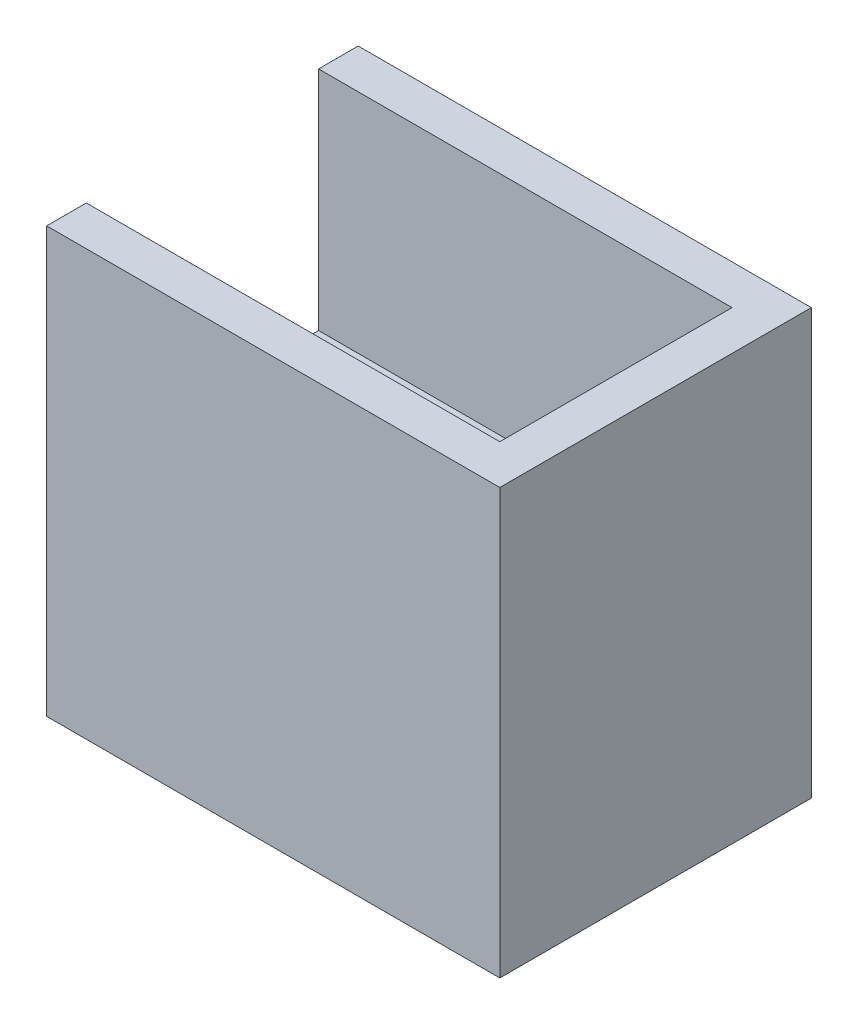
ISO-10303-21;
HEADER;
FILE_DESCRIPTION(('STEP AP214'),'2;1');
FILE_NAME('part.step','',(''),(''),'','','');
FILE_SCHEMA(('AUTOMOTIVE_DESIGN { 1 0 10303 214 1 1 1 1 }'));
ENDSEC;
DATA;
#1=APPLICATION_CONTEXT('core data for automotive mechanical design processes');
#2=APPLICATION_PROTOCOL_DEFINITION('international standard','automotive_design',2000,#1);
#3=PRODUCT_CONTEXT('',#1,'mechanical');
#4=PRODUCT('Part','Part','',(#3));
#5=PRODUCT_RELATED_PRODUCT_CATEGORY('part','',(#4));
#6=PRODUCT_DEFINITION_FORMATION('','',#4);
#7=PRODUCT_DEFINITION_CONTEXT('part definition',#1,'design');
#8=PRODUCT_DEFINITION('design','',#6,#7);
#9=PRODUCT_DEFINITION_SHAPE('','',#8);
#10=(LENGTH_UNIT() NAMED_UNIT(*) SI_UNIT(.MILLI.,.METRE.));
#11=(NAMED_UNIT(*) PLANE_ANGLE_UNIT() SI_UNIT($,.RADIAN.));
#12=(NAMED_UNIT(*) SI_UNIT($,.STERADIAN.) SOLID_ANGLE_UNIT());
#13=UNCERTAINTY_MEASURE_WITH_UNIT(LENGTH_MEASURE(1.E-05),#10,'distance_accuracy_value','');
#14=(GEOMETRIC_REPRESENTATION_CONTEXT(3) GLOBAL_UNCERTAINTY_ASSIGNED_CONTEXT((#13)) GLOBAL_UNIT_ASSIGNED_CONTEXT((#10,
#11,#12)) REPRESENTATION_CONTEXT('',''));
#15=CARTESIAN_POINT('',(0.,0.,0.));
#16=DIRECTION('',(0.,0.,1.));
#17=DIRECTION('',(1.,0.,0.));
#18=AXIS2_PLACEMENT_3D('',#15,#16,#17);
#19=CARTESIAN_POINT('',(7.3,13.,-50.));
#20=DIRECTION('',(0.,1.,0.));
#21=DIRECTION('',(0.,0.,1.));
#22=AXIS2_PLACEMENT_3D('',#19,#20,#21);
#23=CYLINDRICAL_SURFACE('',#22,1.65);
#24=CARTESIAN_POINT('',(7.3,13.,-50.));
#25=DIRECTION('',(0.,1.,0.));
#26=DIRECTION('',(0.,0.,1.));
#27=AXIS2_PLACEMENT_3D('',#24,#25,#26);
#28=CIRCLE('',#27,1.65);
#29=CARTESIAN_POINT('',(7.3,13.,-48.35));
#30=VERTEX_POINT('',#29);
#31=EDGE_CURVE('E26',#30,#30,#28,.T.);
#32=ORIENTED_EDGE('',*,*,#31,.T.);
#33=EDGE_LOOP('',(#32));
#34=FACE_BOUND('',#33,.T.);
#35=CARTESIAN_POINT('',(7.3,7.2,-50.));
#36=DIRECTION('',(0.,-1.,0.));
#37=DIRECTION('',(0.,0.,-1.));
#38=AXIS2_PLACEMENT_3D('',#35,#36,#37);
#39=CIRCLE('',#38,1.65);
#40=CARTESIAN_POINT('',(7.3,7.2,-51.65));
#41=VERTEX_POINT('',#40);
#42=EDGE_CURVE('E11',#41,#41,#39,.T.);
#43=ORIENTED_EDGE('',*,*,#42,.T.);
#44=EDGE_LOOP('',(#43));
#45=FACE_BOUND('',#44,.T.);
#46=ADVANCED_FACE('F16',(#34,#45),#23,.F.);
#47=CARTESIAN_POINT('',(16.,6.,-55.5));
#48=DIRECTION('',(0.,-1.,0.));
#49=DIRECTION('',(0.,0.,-1.));
#50=AXIS2_PLACEMENT_3D('',#47,#48,#49);
#51=PLANE('',#50);
#52=DIRECTION('',(0.,0.,1.));
#53=VECTOR('',#52,1.);
#54=CARTESIAN_POINT('',(0.,6.,-55.5));
#55=LINE('',#54,#53);
#56=CARTESIAN_POINT('',(0.,6.,-45.9));
#57=VERTEX_POINT('',#56);
#58=CARTESIAN_POINT('',(0.,6.,-44.5));
#59=VERTEX_POINT('',#58);
#60=EDGE_CURVE('E175',#57,#59,#55,.T.);
#61=ORIENTED_EDGE('',*,*,#60,.F.);
#62=DIRECTION('',(-1.,0.,0.));
#63=VECTOR('',#62,1.);
#64=CARTESIAN_POINT('',(14.6,6.,-45.9));
#65=LINE('',#64,#63);
#66=CARTESIAN_POINT('',(14.6,6.,-45.9));
#67=VERTEX_POINT('',#66);
#68=EDGE_CURVE('E35',#67,#57,#65,.T.);
#69=ORIENTED_EDGE('',*,*,#68,.F.);
#70=DIRECTION('',(0.,0.,1.));
#71=VECTOR('',#70,1.);
#72=CARTESIAN_POINT('',(14.6,6.,-40.));
#73=LINE('',#72,#71);
#74=CARTESIAN_POINT('',(14.6,6.,-54.1));
#75=VERTEX_POINT('',#74);
#76=EDGE_CURVE('E146',#75,#67,#73,.T.);
#77=ORIENTED_EDGE('',*,*,#76,.F.);
#78=DIRECTION('',(-1.,0.,0.));
#79=VECTOR('',#78,1.);
#80=CARTESIAN_POINT('',(14.6,6.,-54.1));
#81=LINE('',#80,#79);
#82=CARTESIAN_POINT('',(0.,6.,-54.1));
#83=VERTEX_POINT('',#82);
#84=EDGE_CURVE('E199',#75,#83,#81,.T.);
#85=ORIENTED_EDGE('',*,*,#84,.T.);
#86=DIRECTION('',(0.,0.,1.));
#87=VECTOR('',#86,1.);
#88=CARTESIAN_POINT('',(0.,6.,-55.5));
#89=LINE('',#88,#87);
#90=CARTESIAN_POINT('',(0.,6.,-55.5));
#91=VERTEX_POINT('',#90);
#92=EDGE_CURVE('E185',#91,#83,#89,.T.);
#93=ORIENTED_EDGE('',*,*,#92,.F.);
#94=DIRECTION('',(-1.,0.,0.));
#95=VECTOR('',#94,1.);
#96=CARTESIAN_POINT('',(16.,6.,-55.5));
#97=LINE('',#96,#95);
#98=CARTESIAN_POINT('',(16.,6.,-55.5));
#99=VERTEX_POINT('',#98);
#100=EDGE_CURVE('E158',#99,#91,#97,.T.);
#101=ORIENTED_EDGE('',*,*,#100,.F.);
#102=DIRECTION('',(0.,0.,1.));
#103=VECTOR('',#102,1.);
#104=CARTESIAN_POINT('',(16.,6.,-55.5));
#105=LINE('',#104,#103);
#106=CARTESIAN_POINT('',(16.,6.,-44.5));
#107=VERTEX_POINT('',#106);
#108=EDGE_CURVE('E196',#99,#107,#105,.T.);
#109=ORIENTED_EDGE('',*,*,#108,.T.);
#110=DIRECTION('',(-1.,0.,0.));
#111=VECTOR('',#110,1.);
#112=CARTESIAN_POINT('',(16.,6.,-44.5));
#113=LINE('',#112,#111);
#114=EDGE_CURVE('E192',#107,#59,#113,.T.);
#115=ORIENTED_EDGE('',*,*,#114,.T.);
#116=EDGE_LOOP('',(#61,#69,#77,#85,#93,#101,#109,#115));
#117=FACE_BOUND('',#116,.T.);
#118=ADVANCED_FACE('F226',(#117),#51,.T.);
#119=CARTESIAN_POINT('',(0.,0.,-40.));
#120=DIRECTION('',(-1.,0.,0.));
#121=DIRECTION('',(0.,0.,1.));
#122=AXIS2_PLACEMENT_3D('',#119,#120,#121);
#123=PLANE('',#122);
#124=DIRECTION('',(0.,-1.,0.));
#125=VECTOR('',#124,1.);
#126=CARTESIAN_POINT('',(0.,0.,-54.1));
#127=LINE('',#126,#125);
#128=CARTESIAN_POINT('',(0.,21.,-54.1));
#129=VERTEX_POINT('',#128);
#130=CARTESIAN_POINT('',(0.,13.,-54.1));
#131=VERTEX_POINT('',#130);
#132=EDGE_CURVE('E121',#129,#131,#127,.T.);
#133=ORIENTED_EDGE('',*,*,#132,.F.);
#134=DIRECTION('',(0.,0.,-1.));
#135=VECTOR('',#134,1.);
#136=CARTESIAN_POINT('',(0.,21.,-44.5));
#137=LINE('',#136,#135);
#138=CARTESIAN_POINT('',(0.,21.,-55.5));
#139=VERTEX_POINT('',#138);
#140=EDGE_CURVE('E189',#129,#139,#137,.T.);
#141=ORIENTED_EDGE('',*,*,#140,.T.);
#142=DIRECTION('',(0.,-1.,0.));
#143=VECTOR('',#142,1.);
#144=CARTESIAN_POINT('',(0.,21.,-55.5));
#145=LINE('',#144,#143);
#146=EDGE_CURVE('E186',#139,#91,#145,.T.);
#147=ORIENTED_EDGE('',*,*,#146,.T.);
#148=ORIENTED_EDGE('',*,*,#92,.T.);
#149=DIRECTION('',(0.,1.,0.));
#150=VECTOR('',#149,1.);
#151=CARTESIAN_POINT('',(0.,0.,-54.1));
#152=LINE('',#151,#150);
#153=CARTESIAN_POINT('',(0.,7.2,-54.1));
#154=VERTEX_POINT('',#153);
#155=EDGE_CURVE('E182',#83,#154,#152,.T.);
#156=ORIENTED_EDGE('',*,*,#155,.T.);
#157=DIRECTION('',(0.,0.,1.));
#158=VECTOR('',#157,1.);
#159=CARTESIAN_POINT('',(0.,7.2,-40.));
#160=LINE('',#159,#158);
#161=CARTESIAN_POINT('',(0.,7.2,-45.9));
#162=VERTEX_POINT('',#161);
#163=EDGE_CURVE('E179',#154,#162,#160,.T.);
#164=ORIENTED_EDGE('',*,*,#163,.T.);
#165=DIRECTION('',(0.,-1.,0.));
#166=VECTOR('',#165,1.);
#167=CARTESIAN_POINT('',(0.,0.,-45.9));
#168=LINE('',#167,#166);
#169=EDGE_CURVE('E176',#162,#57,#168,.T.);
#170=ORIENTED_EDGE('',*,*,#169,.T.);
#171=ORIENTED_EDGE('',*,*,#60,.T.);
#172=DIRECTION('',(0.,1.,0.));
#173=VECTOR('',#172,1.);
#174=CARTESIAN_POINT('',(0.,6.,-44.5));
#175=LINE('',#174,#173);
#176=CARTESIAN_POINT('',(0.,21.,-44.5));
#177=VERTEX_POINT('',#176);
#178=EDGE_CURVE('E172',#59,#177,#175,.T.);
#179=ORIENTED_EDGE('',*,*,#178,.T.);
#180=DIRECTION('',(0.,0.,-1.));
#181=VECTOR('',#180,1.);
#182=CARTESIAN_POINT('',(0.,21.,-44.5));
#183=LINE('',#182,#181);
#184=CARTESIAN_POINT('',(0.,21.,-45.9));
#185=VERTEX_POINT('',#184);
#186=EDGE_CURVE('E165',#177,#185,#183,.T.);
#187=ORIENTED_EDGE('',*,*,#186,.T.);
#188=DIRECTION('',(0.,1.,0.));
#189=VECTOR('',#188,1.);
#190=CARTESIAN_POINT('',(0.,0.,-45.9));
#191=LINE('',#190,#189);
#192=CARTESIAN_POINT('',(0.,13.,-45.9));
#193=VERTEX_POINT('',#192);
#194=EDGE_CURVE('E130',#193,#185,#191,.T.);
#195=ORIENTED_EDGE('',*,*,#194,.F.);
#196=DIRECTION('',(0.,0.,1.));
#197=VECTOR('',#196,1.);
#198=CARTESIAN_POINT('',(0.,13.,-40.));
#199=LINE('',#198,#197);
#200=EDGE_CURVE('E123',#131,#193,#199,.T.);
#201=ORIENTED_EDGE('',*,*,#200,.F.);
#202=EDGE_LOOP('',(#133,#141,#147,#148,#156,#164,#170,#171,#179,#187,#195,#201));
#203=FACE_BOUND('',#202,.T.);
#204=ADVANCED_FACE('F231',(#203),#123,.T.);
#205=CARTESIAN_POINT('',(16.,21.,-55.5));
#206=DIRECTION('',(0.,0.,-1.));
#207=DIRECTION('',(0.,1.,0.));
#208=AXIS2_PLACEMENT_3D('',#205,#206,#207);
#209=PLANE('',#208);
#210=ORIENTED_EDGE('',*,*,#146,.F.);
#211=DIRECTION('',(-1.,0.,0.));
#212=VECTOR('',#211,1.);
#213=CARTESIAN_POINT('',(16.,21.,-55.5));
#214=LINE('',#213,#212);
#215=CARTESIAN_POINT('',(16.,21.,-55.5));
#216=VERTEX_POINT('',#215);
#217=EDGE_CURVE('E150',#216,#139,#214,.T.);
#218=ORIENTED_EDGE('',*,*,#217,.F.);
#219=DIRECTION('',(0.,-1.,0.));
#220=VECTOR('',#219,1.);
#221=CARTESIAN_POINT('',(16.,21.,-55.5));
#222=LINE('',#221,#220);
#223=EDGE_CURVE('E162',#216,#99,#222,.T.);
#224=ORIENTED_EDGE('',*,*,#223,.T.);
#225=ORIENTED_EDGE('',*,*,#100,.T.);
#226=EDGE_LOOP('',(#210,#218,#224,#225));
#227=FACE_BOUND('',#226,.T.);
#228=ADVANCED_FACE('F237',(#227),#209,.T.);
#229=CARTESIAN_POINT('',(16.,21.,-44.5));
#230=DIRECTION('',(0.,1.,0.));
#231=DIRECTION('',(0.,0.,1.));
#232=AXIS2_PLACEMENT_3D('',#229,#230,#231);
#233=PLANE('',#232);
#234=DIRECTION('',(-1.,0.,0.));
#235=VECTOR('',#234,1.);
#236=CARTESIAN_POINT('',(14.6,21.,-54.1));
#237=LINE('',#236,#235);
#238=CARTESIAN_POINT('',(14.6,21.,-54.1));
#239=VERTEX_POINT('',#238);
#240=EDGE_CURVE('E160',#239,#129,#237,.T.);
#241=ORIENTED_EDGE('',*,*,#240,.F.);
#242=DIRECTION('',(0.,0.,-1.));
#243=VECTOR('',#242,1.);
#244=CARTESIAN_POINT('',(14.6,21.,-40.));
#245=LINE('',#244,#243);
#246=CARTESIAN_POINT('',(14.6,21.,-45.9));
#247=VERTEX_POINT('',#246);
#248=EDGE_CURVE('E125',#247,#239,#245,.T.);
#249=ORIENTED_EDGE('',*,*,#248,.F.);
#250=DIRECTION('',(-1.,0.,0.));
#251=VECTOR('',#250,1.);
#252=CARTESIAN_POINT('',(14.6,21.,-45.9));
#253=LINE('',#252,#251);
#254=EDGE_CURVE('E154',#247,#185,#253,.T.);
#255=ORIENTED_EDGE('',*,*,#254,.T.);
#256=ORIENTED_EDGE('',*,*,#186,.F.);
#257=DIRECTION('',(-1.,0.,0.));
#258=VECTOR('',#257,1.);
#259=CARTESIAN_POINT('',(16.,21.,-44.5));
#260=LINE('',#259,#258);
#261=CARTESIAN_POINT('',(16.,21.,-44.5));
#262=VERTEX_POINT('',#261);
#263=EDGE_CURVE('E143',#262,#177,#260,.T.);
#264=ORIENTED_EDGE('',*,*,#263,.F.);
#265=DIRECTION('',(0.,0.,-1.));
#266=VECTOR('',#265,1.);
#267=CARTESIAN_POINT('',(16.,21.,-44.5));
#268=LINE('',#267,#266);
#269=EDGE_CURVE('E151',#262,#216,#268,.T.);
#270=ORIENTED_EDGE('',*,*,#269,.T.);
#271=ORIENTED_EDGE('',*,*,#217,.T.);
#272=ORIENTED_EDGE('',*,*,#140,.F.);
#273=EDGE_LOOP('',(#241,#249,#255,#256,#264,#270,#271,#272));
#274=FACE_BOUND('',#273,.T.);
#275=ADVANCED_FACE('F241',(#274),#233,.T.);
#276=CARTESIAN_POINT('',(16.,6.,-44.5));
#277=DIRECTION('',(0.,0.,1.));
#278=DIRECTION('',(1.,0.,0.));
#279=AXIS2_PLACEMENT_3D('',#276,#277,#278);
#280=PLANE('',#279);
#281=ORIENTED_EDGE('',*,*,#178,.F.);
#282=ORIENTED_EDGE('',*,*,#114,.F.);
#283=DIRECTION('',(0.,1.,0.));
#284=VECTOR('',#283,1.);
#285=CARTESIAN_POINT('',(16.,6.,-44.5));
#286=LINE('',#285,#284);
#287=EDGE_CURVE('E147',#107,#262,#286,.T.);
#288=ORIENTED_EDGE('',*,*,#287,.T.);
#289=ORIENTED_EDGE('',*,*,#263,.T.);
#290=EDGE_LOOP('',(#281,#282,#288,#289));
#291=FACE_BOUND('',#290,.T.);
#292=ADVANCED_FACE('F245',(#291),#280,.T.);
#293=CARTESIAN_POINT('',(16.,0.,-40.));
#294=DIRECTION('',(-1.,0.,0.));
#295=DIRECTION('',(0.,0.,1.));
#296=AXIS2_PLACEMENT_3D('',#293,#294,#295);
#297=PLANE('',#296);
#298=ORIENTED_EDGE('',*,*,#108,.F.);
#299=ORIENTED_EDGE('',*,*,#223,.F.);
#300=ORIENTED_EDGE('',*,*,#269,.F.);
#301=ORIENTED_EDGE('',*,*,#287,.F.);
#302=EDGE_LOOP('',(#298,#299,#300,#301));
#303=FACE_BOUND('',#302,.T.);
#304=ADVANCED_FACE('F249',(#303),#297,.F.);
#305=CARTESIAN_POINT('',(14.6,0.,-45.9));
#306=DIRECTION('',(0.,0.,-1.));
#307=DIRECTION('',(-1.,0.,0.));
#308=AXIS2_PLACEMENT_3D('',#305,#306,#307);
#309=PLANE('',#308);
#310=ORIENTED_EDGE('',*,*,#169,.F.);
#311=DIRECTION('',(-1.,0.,0.));
#312=VECTOR('',#311,1.);
#313=CARTESIAN_POINT('',(14.6,7.2,-45.9));
#314=LINE('',#313,#312);
#315=CARTESIAN_POINT('',(14.6,7.2,-45.9));
#316=VERTEX_POINT('',#315);
#317=EDGE_CURVE('E135',#316,#162,#314,.T.);
#318=ORIENTED_EDGE('',*,*,#317,.F.);
#319=DIRECTION('',(0.,-1.,0.));
#320=VECTOR('',#319,1.);
#321=CARTESIAN_POINT('',(14.6,0.,-45.9));
#322=LINE('',#321,#320);
#323=EDGE_CURVE('E141',#316,#67,#322,.T.);
#324=ORIENTED_EDGE('',*,*,#323,.T.);
#325=ORIENTED_EDGE('',*,*,#68,.T.);
#326=EDGE_LOOP('',(#310,#318,#324,#325));
#327=FACE_BOUND('',#326,.T.);
#328=ADVANCED_FACE('F253',(#327),#309,.T.);
#329=CARTESIAN_POINT('',(14.6,0.,-54.1));
#330=DIRECTION('',(0.,0.,1.));
#331=DIRECTION('',(1.,0.,0.));
#332=AXIS2_PLACEMENT_3D('',#329,#330,#331);
#333=PLANE('',#332);
#334=ORIENTED_EDGE('',*,*,#155,.F.);
#335=ORIENTED_EDGE('',*,*,#84,.F.);
#336=DIRECTION('',(0.,1.,0.));
#337=VECTOR('',#336,1.);
#338=CARTESIAN_POINT('',(14.6,0.,-54.1));
#339=LINE('',#338,#337);
#340=CARTESIAN_POINT('',(14.6,7.2,-54.1));
#341=VERTEX_POINT('',#340);
#342=EDGE_CURVE('E138',#75,#341,#339,.T.);
#343=ORIENTED_EDGE('',*,*,#342,.T.);
#344=DIRECTION('',(-1.,0.,0.));
#345=VECTOR('',#344,1.);
#346=CARTESIAN_POINT('',(14.6,7.2,-54.1));
#347=LINE('',#346,#345);
#348=EDGE_CURVE('E134',#341,#154,#347,.T.);
#349=ORIENTED_EDGE('',*,*,#348,.T.);
#350=EDGE_LOOP('',(#334,#335,#343,#349));
#351=FACE_BOUND('',#350,.T.);
#352=ADVANCED_FACE('F257',(#351),#333,.T.);
#353=CARTESIAN_POINT('',(14.6,7.2,-40.));
#354=DIRECTION('',(0.,-1.,0.));
#355=DIRECTION('',(0.,0.,-1.));
#356=AXIS2_PLACEMENT_3D('',#353,#354,#355);
#357=PLANE('',#356);
#358=ORIENTED_EDGE('',*,*,#42,.F.);
#359=EDGE_LOOP('',(#358));
#360=FACE_BOUND('',#359,.T.);
#361=ORIENTED_EDGE('',*,*,#163,.F.);
#362=ORIENTED_EDGE('',*,*,#348,.F.);
#363=DIRECTION('',(0.,0.,1.));
#364=VECTOR('',#363,1.);
#365=CARTESIAN_POINT('',(14.6,7.2,-40.));
#366=LINE('',#365,#364);
#367=EDGE_CURVE('E131',#341,#316,#366,.T.);
#368=ORIENTED_EDGE('',*,*,#367,.T.);
#369=ORIENTED_EDGE('',*,*,#317,.T.);
#370=EDGE_LOOP('',(#361,#362,#368,#369));
#371=FACE_BOUND('',#370,.T.);
#372=ADVANCED_FACE('F222',(#360,#371),#357,.T.);
#373=CARTESIAN_POINT('',(14.6,0.,-40.));
#374=DIRECTION('',(-1.,0.,0.));
#375=DIRECTION('',(0.,0.,1.));
#376=AXIS2_PLACEMENT_3D('',#373,#374,#375);
#377=PLANE('',#376);
#378=ORIENTED_EDGE('',*,*,#323,.F.);
#379=ORIENTED_EDGE('',*,*,#367,.F.);
#380=ORIENTED_EDGE('',*,*,#342,.F.);
#381=ORIENTED_EDGE('',*,*,#76,.T.);
#382=EDGE_LOOP('',(#378,#379,#380,#381));
#383=FACE_BOUND('',#382,.T.);
#384=ADVANCED_FACE('F213',(#383),#377,.T.);
#385=CARTESIAN_POINT('',(14.6,13.,-40.));
#386=DIRECTION('',(0.,-1.,0.));
#387=DIRECTION('',(0.,0.,-1.));
#388=AXIS2_PLACEMENT_3D('',#385,#386,#387);
#389=PLANE('',#388);
#390=ORIENTED_EDGE('',*,*,#31,.F.);
#391=EDGE_LOOP('',(#390));
#392=FACE_BOUND('',#391,.T.);
#393=ORIENTED_EDGE('',*,*,#200,.T.);
#394=DIRECTION('',(-1.,0.,0.));
#395=VECTOR('',#394,1.);
#396=CARTESIAN_POINT('',(14.6,13.,-45.9));
#397=LINE('',#396,#395);
#398=CARTESIAN_POINT('',(14.6,13.,-45.9));
#399=VERTEX_POINT('',#398);
#400=EDGE_CURVE('E113',#399,#193,#397,.T.);
#401=ORIENTED_EDGE('',*,*,#400,.F.);
#402=DIRECTION('',(0.,0.,1.));
#403=VECTOR('',#402,1.);
#404=CARTESIAN_POINT('',(14.6,13.,-40.));
#405=LINE('',#404,#403);
#406=CARTESIAN_POINT('',(14.6,13.,-54.1));
#407=VERTEX_POINT('',#406);
#408=EDGE_CURVE('E104',#407,#399,#405,.T.);
#409=ORIENTED_EDGE('',*,*,#408,.F.);
#410=DIRECTION('',(-1.,0.,0.));
#411=VECTOR('',#410,1.);
#412=CARTESIAN_POINT('',(14.6,13.,-54.1));
#413=LINE('',#412,#411);
#414=EDGE_CURVE('E111',#407,#131,#413,.T.);
#415=ORIENTED_EDGE('',*,*,#414,.T.);
#416=EDGE_LOOP('',(#393,#401,#409,#415));
#417=FACE_BOUND('',#416,.T.);
#418=ADVANCED_FACE('F110',(#392,#417),#389,.F.);
#419=CARTESIAN_POINT('',(14.6,0.,-54.1));
#420=DIRECTION('',(0.,0.,-1.));
#421=DIRECTION('',(0.,1.,0.));
#422=AXIS2_PLACEMENT_3D('',#419,#420,#421);
#423=PLANE('',#422);
#424=ORIENTED_EDGE('',*,*,#132,.T.);
#425=ORIENTED_EDGE('',*,*,#414,.F.);
#426=DIRECTION('',(0.,-1.,0.));
#427=VECTOR('',#426,1.);
#428=CARTESIAN_POINT('',(14.6,0.,-54.1));
#429=LINE('',#428,#427);
#430=EDGE_CURVE('E120',#239,#407,#429,.T.);
#431=ORIENTED_EDGE('',*,*,#430,.F.);
#432=ORIENTED_EDGE('',*,*,#240,.T.);
#433=EDGE_LOOP('',(#424,#425,#431,#432));
#434=FACE_BOUND('',#433,.T.);
#435=ADVANCED_FACE('F118',(#434),#423,.F.);
#436=CARTESIAN_POINT('',(14.6,0.,-45.9));
#437=DIRECTION('',(0.,0.,1.));
#438=DIRECTION('',(1.,0.,0.));
#439=AXIS2_PLACEMENT_3D('',#436,#437,#438);
#440=PLANE('',#439);
#441=ORIENTED_EDGE('',*,*,#194,.T.);
#442=ORIENTED_EDGE('',*,*,#254,.F.);
#443=DIRECTION('',(0.,1.,0.));
#444=VECTOR('',#443,1.);
#445=CARTESIAN_POINT('',(14.6,0.,-45.9));
#446=LINE('',#445,#444);
#447=EDGE_CURVE('E20',#399,#247,#446,.T.);
#448=ORIENTED_EDGE('',*,*,#447,.F.);
#449=ORIENTED_EDGE('',*,*,#400,.T.);
#450=EDGE_LOOP('',(#441,#442,#448,#449));
#451=FACE_BOUND('',#450,.T.);
#452=ADVANCED_FACE('F220',(#451),#440,.F.);
#453=CARTESIAN_POINT('',(14.6,0.,-40.));
#454=DIRECTION('',(-1.,0.,0.));
#455=DIRECTION('',(0.,0.,1.));
#456=AXIS2_PLACEMENT_3D('',#453,#454,#455);
#457=PLANE('',#456);
#458=ORIENTED_EDGE('',*,*,#408,.T.);
#459=ORIENTED_EDGE('',*,*,#447,.T.);
#460=ORIENTED_EDGE('',*,*,#248,.T.);
#461=ORIENTED_EDGE('',*,*,#430,.T.);
#462=EDGE_LOOP('',(#458,#459,#460,#461));
#463=FACE_BOUND('',#462,.T.);
#464=ADVANCED_FACE('F18',(#463),#457,.T.);
#465=CLOSED_SHELL('',(#46,#118,#204,#228,#275,#292,#304,#328,#352,#372,#384,#418,#435,#452,#464));
#466=MANIFOLD_SOLID_BREP('B1',#465);
#467=ADVANCED_BREP_SHAPE_REPRESENTATION('',(#18,#466),#14);
#468=SHAPE_DEFINITION_REPRESENTATION(#9,#467);
ENDSEC;
END-ISO-10303-21;
